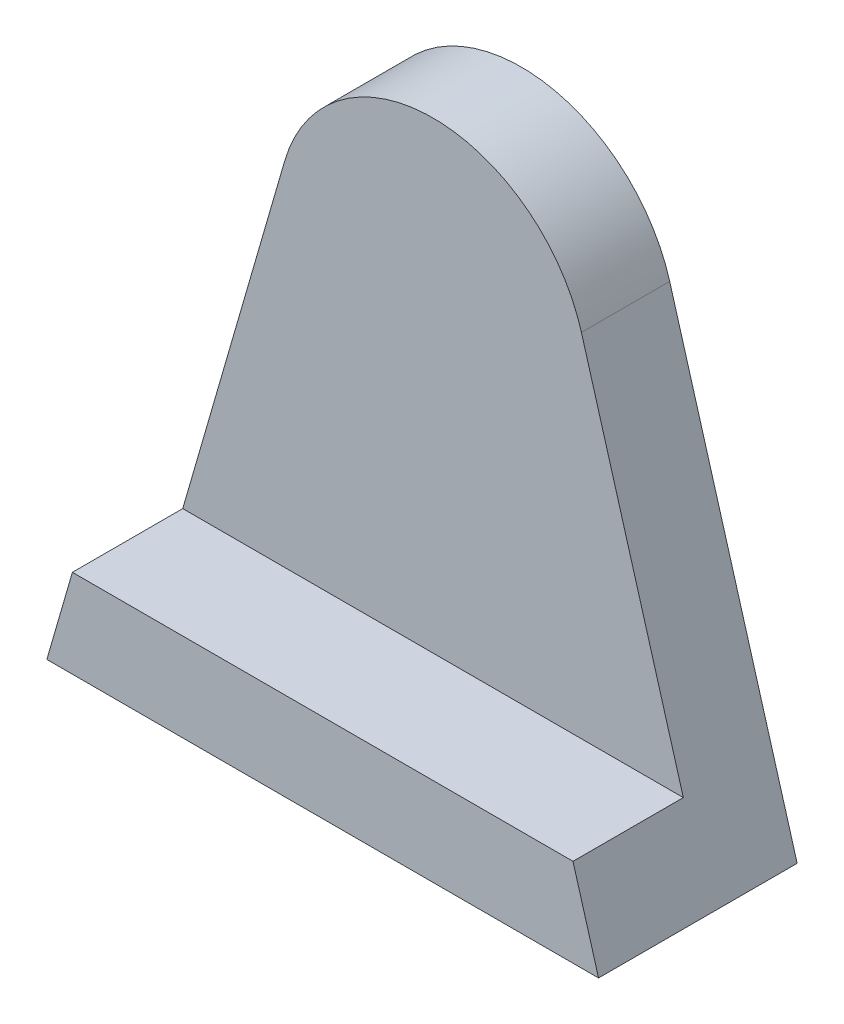
ISO-10303-21;
HEADER;
FILE_DESCRIPTION(('STEP AP214'),'2;1');
FILE_NAME('part.step','',(''),(''),'','','');
FILE_SCHEMA(('AUTOMOTIVE_DESIGN { 1 0 10303 214 1 1 1 1 }'));
ENDSEC;
DATA;
#1=APPLICATION_CONTEXT('core data for automotive mechanical design processes');
#2=APPLICATION_PROTOCOL_DEFINITION('international standard','automotive_design',2000,#1);
#3=PRODUCT_CONTEXT('',#1,'mechanical');
#4=PRODUCT('Part','Part','',(#3));
#5=PRODUCT_RELATED_PRODUCT_CATEGORY('part','',(#4));
#6=PRODUCT_DEFINITION_FORMATION('','',#4);
#7=PRODUCT_DEFINITION_CONTEXT('part definition',#1,'design');
#8=PRODUCT_DEFINITION('design','',#6,#7);
#9=PRODUCT_DEFINITION_SHAPE('','',#8);
#10=(LENGTH_UNIT() NAMED_UNIT(*) SI_UNIT(.MILLI.,.METRE.));
#11=(NAMED_UNIT(*) PLANE_ANGLE_UNIT() SI_UNIT($,.RADIAN.));
#12=(NAMED_UNIT(*) SI_UNIT($,.STERADIAN.) SOLID_ANGLE_UNIT());
#13=UNCERTAINTY_MEASURE_WITH_UNIT(LENGTH_MEASURE(1.E-05),#10,'distance_accuracy_value','');
#14=(GEOMETRIC_REPRESENTATION_CONTEXT(3) GLOBAL_UNCERTAINTY_ASSIGNED_CONTEXT((#13)) GLOBAL_UNIT_ASSIGNED_CONTEXT((#10,
#11,#12)) REPRESENTATION_CONTEXT('',''));
#15=CARTESIAN_POINT('',(0.,0.,0.));
#16=DIRECTION('',(0.,0.,1.));
#17=DIRECTION('',(1.,0.,0.));
#18=AXIS2_PLACEMENT_3D('',#15,#16,#17);
#19=CARTESIAN_POINT('',(0.,18.,4.));
#20=DIRECTION('',(0.,0.,-1.));
#21=DIRECTION('',(-1.,0.,0.));
#22=AXIS2_PLACEMENT_3D('',#19,#20,#21);
#23=PLANE('',#22);
#24=DIRECTION('',(-1.,0.,0.));
#25=VECTOR('',#24,1.);
#26=CARTESIAN_POINT('',(11.3416860741973,4.,4.));
#27=LINE('',#26,#25);
#28=CARTESIAN_POINT('',(11.3416860741973,4.,4.));
#29=VERTEX_POINT('',#28);
#30=CARTESIAN_POINT('',(-11.3416860741973,4.,4.));
#31=VERTEX_POINT('',#30);
#32=EDGE_CURVE('E53',#29,#31,#27,.T.);
#33=ORIENTED_EDGE('',*,*,#32,.F.);
#34=DIRECTION('',(-0.278150954120125,0.960537373932979,0.));
#35=VECTOR('',#34,1.);
#36=CARTESIAN_POINT('',(6.72376161753085,19.9470566788409,4.));
#37=LINE('',#36,#35);
#38=CARTESIAN_POINT('',(6.72376161753085,19.9470566788409,4.));
#39=VERTEX_POINT('',#38);
#40=EDGE_CURVE('E91',#29,#39,#37,.T.);
#41=ORIENTED_EDGE('',*,*,#40,.T.);
#42=CARTESIAN_POINT('',(0.,18.,4.));
#43=DIRECTION('',(0.,0.,1.));
#44=DIRECTION('',(-1.,0.,0.));
#45=AXIS2_PLACEMENT_3D('',#42,#43,#44);
#46=CIRCLE('',#45,7.);
#47=CARTESIAN_POINT('',(-6.72376161753086,19.9470566788409,4.));
#48=VERTEX_POINT('',#47);
#49=EDGE_CURVE('E59',#39,#48,#46,.T.);
#50=ORIENTED_EDGE('',*,*,#49,.T.);
#51=DIRECTION('',(-0.278150954120124,-0.96053737393298,0.));
#52=VECTOR('',#51,1.);
#53=CARTESIAN_POINT('',(-12.5,0.,4.));
#54=LINE('',#53,#52);
#55=EDGE_CURVE('E101',#48,#31,#54,.T.);
#56=ORIENTED_EDGE('',*,*,#55,.T.);
#57=EDGE_LOOP('',(#33,#41,#50,#56));
#58=FACE_BOUND('',#57,.T.);
#59=ADVANCED_FACE('F38',(#58),#23,.F.);
#60=CARTESIAN_POINT('',(12.5,0.,4.));
#61=DIRECTION('',(0.,1.,0.));
#62=DIRECTION('',(-1.,0.,0.));
#63=AXIS2_PLACEMENT_3D('',#60,#61,#62);
#64=PLANE('',#63);
#65=DIRECTION('',(1.,0.,0.));
#66=VECTOR('',#65,1.);
#67=CARTESIAN_POINT('',(12.5,0.,0.));
#68=LINE('',#67,#66);
#69=CARTESIAN_POINT('',(-12.5,0.,0.));
#70=VERTEX_POINT('',#69);
#71=CARTESIAN_POINT('',(12.5,0.,0.));
#72=VERTEX_POINT('',#71);
#73=EDGE_CURVE('E97',#70,#72,#68,.T.);
#74=ORIENTED_EDGE('',*,*,#73,.T.);
#75=DIRECTION('',(0.,0.,-1.));
#76=VECTOR('',#75,1.);
#77=CARTESIAN_POINT('',(12.5,0.,4.));
#78=LINE('',#77,#76);
#79=CARTESIAN_POINT('',(12.5,0.,9.));
#80=VERTEX_POINT('',#79);
#81=EDGE_CURVE('E11',#80,#72,#78,.T.);
#82=ORIENTED_EDGE('',*,*,#81,.F.);
#83=DIRECTION('',(1.,0.,0.));
#84=VECTOR('',#83,1.);
#85=CARTESIAN_POINT('',(-12.5,0.,9.));
#86=LINE('',#85,#84);
#87=CARTESIAN_POINT('',(-12.5,0.,9.));
#88=VERTEX_POINT('',#87);
#89=EDGE_CURVE('E99',#88,#80,#86,.T.);
#90=ORIENTED_EDGE('',*,*,#89,.F.);
#91=DIRECTION('',(0.,0.,-1.));
#92=VECTOR('',#91,1.);
#93=CARTESIAN_POINT('',(-12.5,0.,4.));
#94=LINE('',#93,#92);
#95=EDGE_CURVE('E84',#88,#70,#94,.T.);
#96=ORIENTED_EDGE('',*,*,#95,.T.);
#97=EDGE_LOOP('',(#74,#82,#90,#96));
#98=FACE_BOUND('',#97,.T.);
#99=ADVANCED_FACE('F40',(#98),#64,.F.);
#100=CARTESIAN_POINT('',(6.72376161753085,19.9470566788409,4.));
#101=DIRECTION('',(-0.960537373932979,-0.278150954120125,0.));
#102=DIRECTION('',(0.278150954120125,-0.960537373932979,0.));
#103=AXIS2_PLACEMENT_3D('',#100,#101,#102);
#104=PLANE('',#103);
#105=DIRECTION('',(-0.278150954120125,0.960537373932979,0.));
#106=VECTOR('',#105,1.);
#107=CARTESIAN_POINT('',(6.72376161753085,19.9470566788409,0.));
#108=LINE('',#107,#106);
#109=CARTESIAN_POINT('',(6.72376161753085,19.9470566788409,0.));
#110=VERTEX_POINT('',#109);
#111=EDGE_CURVE('E104',#72,#110,#108,.T.);
#112=ORIENTED_EDGE('',*,*,#111,.T.);
#113=DIRECTION('',(0.,0.,-1.));
#114=VECTOR('',#113,1.);
#115=CARTESIAN_POINT('',(6.72376161753085,19.9470566788409,4.));
#116=LINE('',#115,#114);
#117=EDGE_CURVE('E46',#39,#110,#116,.T.);
#118=ORIENTED_EDGE('',*,*,#117,.F.);
#119=ORIENTED_EDGE('',*,*,#40,.F.);
#120=DIRECTION('',(0.,0.,-1.));
#121=VECTOR('',#120,1.);
#122=CARTESIAN_POINT('',(11.3416860741973,4.,9.));
#123=LINE('',#122,#121);
#124=CARTESIAN_POINT('',(11.3416860741973,4.,9.));
#125=VERTEX_POINT('',#124);
#126=EDGE_CURVE('E105',#125,#29,#123,.T.);
#127=ORIENTED_EDGE('',*,*,#126,.F.);
#128=DIRECTION('',(-0.278150954120125,0.960537373932979,0.));
#129=VECTOR('',#128,1.);
#130=CARTESIAN_POINT('',(12.5,0.,9.));
#131=LINE('',#130,#129);
#132=EDGE_CURVE('E125',#80,#125,#131,.T.);
#133=ORIENTED_EDGE('',*,*,#132,.F.);
#134=ORIENTED_EDGE('',*,*,#81,.T.);
#135=EDGE_LOOP('',(#112,#118,#119,#127,#133,#134));
#136=FACE_BOUND('',#135,.T.);
#137=ADVANCED_FACE('F120',(#136),#104,.F.);
#138=CARTESIAN_POINT('',(0.,18.,4.));
#139=DIRECTION('',(0.,0.,-1.));
#140=DIRECTION('',(-1.,0.,0.));
#141=AXIS2_PLACEMENT_3D('',#138,#139,#140);
#142=CYLINDRICAL_SURFACE('',#141,7.);
#143=CARTESIAN_POINT('',(0.,18.,0.));
#144=DIRECTION('',(0.,0.,1.));
#145=DIRECTION('',(-1.,0.,0.));
#146=AXIS2_PLACEMENT_3D('',#143,#144,#145);
#147=CIRCLE('',#146,7.);
#148=CARTESIAN_POINT('',(-6.72376161753086,19.9470566788409,0.));
#149=VERTEX_POINT('',#148);
#150=EDGE_CURVE('E92',#110,#149,#147,.T.);
#151=ORIENTED_EDGE('',*,*,#150,.T.);
#152=DIRECTION('',(0.,0.,-1.));
#153=VECTOR('',#152,1.);
#154=CARTESIAN_POINT('',(-6.72376161753086,19.9470566788409,4.));
#155=LINE('',#154,#153);
#156=EDGE_CURVE('E87',#48,#149,#155,.T.);
#157=ORIENTED_EDGE('',*,*,#156,.F.);
#158=ORIENTED_EDGE('',*,*,#49,.F.);
#159=ORIENTED_EDGE('',*,*,#117,.T.);
#160=EDGE_LOOP('',(#151,#157,#158,#159));
#161=FACE_BOUND('',#160,.T.);
#162=ADVANCED_FACE('F118',(#161),#142,.T.);
#163=CARTESIAN_POINT('',(-12.5,0.,4.));
#164=DIRECTION('',(0.96053737393298,-0.278150954120124,0.));
#165=DIRECTION('',(0.278150954120124,0.96053737393298,0.));
#166=AXIS2_PLACEMENT_3D('',#163,#164,#165);
#167=PLANE('',#166);
#168=DIRECTION('',(-0.278150954120124,-0.96053737393298,0.));
#169=VECTOR('',#168,1.);
#170=CARTESIAN_POINT('',(-12.5,0.,0.));
#171=LINE('',#170,#169);
#172=EDGE_CURVE('E79',#149,#70,#171,.T.);
#173=ORIENTED_EDGE('',*,*,#172,.T.);
#174=ORIENTED_EDGE('',*,*,#95,.F.);
#175=DIRECTION('',(-0.278150954120124,-0.96053737393298,0.));
#176=VECTOR('',#175,1.);
#177=CARTESIAN_POINT('',(-11.3416860741973,4.,9.));
#178=LINE('',#177,#176);
#179=CARTESIAN_POINT('',(-11.3416860741973,4.,9.));
#180=VERTEX_POINT('',#179);
#181=EDGE_CURVE('E131',#180,#88,#178,.T.);
#182=ORIENTED_EDGE('',*,*,#181,.F.);
#183=DIRECTION('',(0.,0.,-1.));
#184=VECTOR('',#183,1.);
#185=CARTESIAN_POINT('',(-11.3416860741973,4.,9.));
#186=LINE('',#185,#184);
#187=EDGE_CURVE('E109',#180,#31,#186,.T.);
#188=ORIENTED_EDGE('',*,*,#187,.T.);
#189=ORIENTED_EDGE('',*,*,#55,.F.);
#190=ORIENTED_EDGE('',*,*,#156,.T.);
#191=EDGE_LOOP('',(#173,#174,#182,#188,#189,#190));
#192=FACE_BOUND('',#191,.T.);
#193=ADVANCED_FACE('F81',(#192),#167,.F.);
#194=CARTESIAN_POINT('',(0.,18.,0.));
#195=DIRECTION('',(0.,0.,-1.));
#196=DIRECTION('',(-1.,0.,0.));
#197=AXIS2_PLACEMENT_3D('',#194,#195,#196);
#198=PLANE('',#197);
#199=ORIENTED_EDGE('',*,*,#73,.F.);
#200=ORIENTED_EDGE('',*,*,#172,.F.);
#201=ORIENTED_EDGE('',*,*,#150,.F.);
#202=ORIENTED_EDGE('',*,*,#111,.F.);
#203=EDGE_LOOP('',(#199,#200,#201,#202));
#204=FACE_BOUND('',#203,.T.);
#205=ADVANCED_FACE('F103',(#204),#198,.T.);
#206=CARTESIAN_POINT('',(11.3416860741973,4.,9.));
#207=DIRECTION('',(0.,-1.,0.));
#208=DIRECTION('',(1.,0.,0.));
#209=AXIS2_PLACEMENT_3D('',#206,#207,#208);
#210=PLANE('',#209);
#211=ORIENTED_EDGE('',*,*,#32,.T.);
#212=ORIENTED_EDGE('',*,*,#187,.F.);
#213=DIRECTION('',(-1.,0.,0.));
#214=VECTOR('',#213,1.);
#215=CARTESIAN_POINT('',(11.3416860741973,4.,9.));
#216=LINE('',#215,#214);
#217=EDGE_CURVE('E133',#125,#180,#216,.T.);
#218=ORIENTED_EDGE('',*,*,#217,.F.);
#219=ORIENTED_EDGE('',*,*,#126,.T.);
#220=EDGE_LOOP('',(#211,#212,#218,#219));
#221=FACE_BOUND('',#220,.T.);
#222=ADVANCED_FACE('F144',(#221),#210,.F.);
#223=CARTESIAN_POINT('',(0.,0.,9.));
#224=DIRECTION('',(0.,0.,1.));
#225=DIRECTION('',(1.,0.,0.));
#226=AXIS2_PLACEMENT_3D('',#223,#224,#225);
#227=PLANE('',#226);
#228=ORIENTED_EDGE('',*,*,#181,.T.);
#229=ORIENTED_EDGE('',*,*,#89,.T.);
#230=ORIENTED_EDGE('',*,*,#132,.T.);
#231=ORIENTED_EDGE('',*,*,#217,.T.);
#232=EDGE_LOOP('',(#228,#229,#230,#231));
#233=FACE_BOUND('',#232,.T.);
#234=ADVANCED_FACE('F129',(#233),#227,.T.);
#235=CLOSED_SHELL('',(#59,#99,#137,#162,#193,#205,#222,#234));
#236=MANIFOLD_SOLID_BREP('B2',#235);
#237=ADVANCED_BREP_SHAPE_REPRESENTATION('',(#18,#236),#14);
#238=SHAPE_DEFINITION_REPRESENTATION(#9,#237);
ENDSEC;
END-ISO-10303-21;
